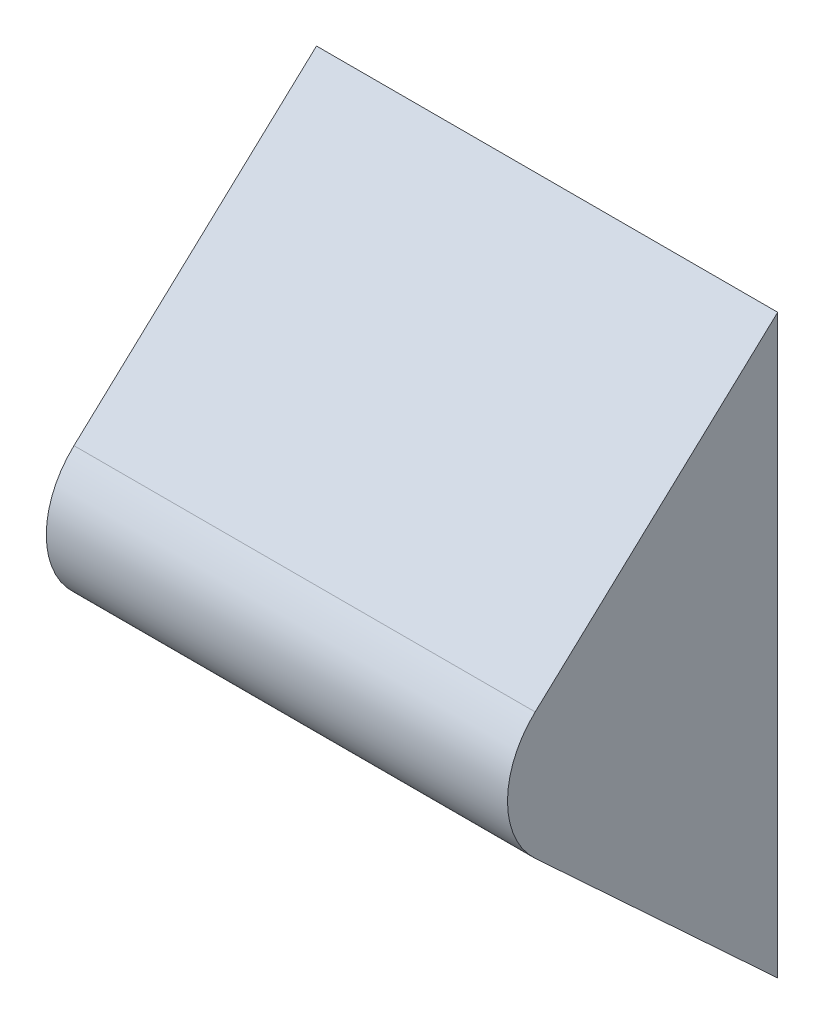
ISO-10303-21;
HEADER;
FILE_DESCRIPTION(('STEP AP214'),'2;1');
FILE_NAME('part.step','',(''),(''),'','','');
FILE_SCHEMA(('AUTOMOTIVE_DESIGN { 1 0 10303 214 1 1 1 1 }'));
ENDSEC;
DATA;
#1=APPLICATION_CONTEXT('core data for automotive mechanical design processes');
#2=APPLICATION_PROTOCOL_DEFINITION('international standard','automotive_design',2000,#1);
#3=PRODUCT_CONTEXT('',#1,'mechanical');
#4=PRODUCT('Part','Part','',(#3));
#5=PRODUCT_RELATED_PRODUCT_CATEGORY('part','',(#4));
#6=PRODUCT_DEFINITION_FORMATION('','',#4);
#7=PRODUCT_DEFINITION_CONTEXT('part definition',#1,'design');
#8=PRODUCT_DEFINITION('design','',#6,#7);
#9=PRODUCT_DEFINITION_SHAPE('','',#8);
#10=(LENGTH_UNIT() NAMED_UNIT(*) SI_UNIT(.MILLI.,.METRE.));
#11=(NAMED_UNIT(*) PLANE_ANGLE_UNIT() SI_UNIT($,.RADIAN.));
#12=(NAMED_UNIT(*) SI_UNIT($,.STERADIAN.) SOLID_ANGLE_UNIT());
#13=UNCERTAINTY_MEASURE_WITH_UNIT(LENGTH_MEASURE(1.E-05),#10,'distance_accuracy_value','');
#14=(GEOMETRIC_REPRESENTATION_CONTEXT(3) GLOBAL_UNCERTAINTY_ASSIGNED_CONTEXT((#13)) GLOBAL_UNIT_ASSIGNED_CONTEXT((#10,
#11,#12)) REPRESENTATION_CONTEXT('',''));
#15=CARTESIAN_POINT('',(0.,0.,0.));
#16=DIRECTION('',(0.,0.,1.));
#17=DIRECTION('',(1.,0.,0.));
#18=AXIS2_PLACEMENT_3D('',#15,#16,#17);
#19=CARTESIAN_POINT('',(40.,0.,0.));
#20=DIRECTION('',(-1.,0.,0.));
#21=DIRECTION('',(0.,0.,1.));
#22=AXIS2_PLACEMENT_3D('',#19,#20,#21);
#23=CYLINDRICAL_SURFACE('',#22,15.);
#24=CARTESIAN_POINT('',(-40.,0.,0.));
#25=DIRECTION('',(1.,0.,0.));
#26=DIRECTION('',(0.,0.,-1.));
#27=AXIS2_PLACEMENT_3D('',#24,#25,#26);
#28=CIRCLE('',#27,15.);
#29=CARTESIAN_POINT('',(-40.,11.,10.1980390271856));
#30=VERTEX_POINT('',#29);
#31=CARTESIAN_POINT('',(-40.,-11.,10.1980390271856));
#32=VERTEX_POINT('',#31);
#33=EDGE_CURVE('E98',#30,#32,#28,.T.);
#34=ORIENTED_EDGE('',*,*,#33,.T.);
#35=DIRECTION('',(-1.,0.,0.));
#36=VECTOR('',#35,1.);
#37=CARTESIAN_POINT('',(40.,-11.,10.1980390271856));
#38=LINE('',#37,#36);
#39=CARTESIAN_POINT('',(40.,-11.,10.1980390271856));
#40=VERTEX_POINT('',#39);
#41=EDGE_CURVE('E11',#40,#32,#38,.T.);
#42=ORIENTED_EDGE('',*,*,#41,.F.);
#43=CARTESIAN_POINT('',(40.,0.,0.));
#44=DIRECTION('',(1.,0.,0.));
#45=DIRECTION('',(0.,0.,-1.));
#46=AXIS2_PLACEMENT_3D('',#43,#44,#45);
#47=CIRCLE('',#46,15.);
#48=CARTESIAN_POINT('',(40.,11.,10.1980390271856));
#49=VERTEX_POINT('',#48);
#50=EDGE_CURVE('E86',#49,#40,#47,.T.);
#51=ORIENTED_EDGE('',*,*,#50,.F.);
#52=DIRECTION('',(-1.,0.,0.));
#53=VECTOR('',#52,1.);
#54=CARTESIAN_POINT('',(40.,11.,10.1980390271856));
#55=LINE('',#54,#53);
#56=EDGE_CURVE('E94',#49,#30,#55,.T.);
#57=ORIENTED_EDGE('',*,*,#56,.T.);
#58=EDGE_LOOP('',(#34,#42,#51,#57));
#59=FACE_BOUND('',#58,.T.);
#60=ADVANCED_FACE('F35',(#59),#23,.T.);
#61=CARTESIAN_POINT('',(40.,-11.,10.1980390271856));
#62=DIRECTION('',(0.,0.733333333333333,-0.679869268479038));
#63=DIRECTION('',(0.,0.679869268479038,0.733333333333333));
#64=AXIS2_PLACEMENT_3D('',#61,#62,#63);
#65=PLANE('',#64);
#66=DIRECTION('',(0.,-0.679869268479038,-0.733333333333333));
#67=VECTOR('',#66,1.);
#68=CARTESIAN_POINT('',(-40.,-11.,10.1980390271856));
#69=LINE('',#68,#67);
#70=CARTESIAN_POINT('',(-40.,-50.,-31.8688719599549));
#71=VERTEX_POINT('',#70);
#72=EDGE_CURVE('E90',#32,#71,#69,.T.);
#73=ORIENTED_EDGE('',*,*,#72,.T.);
#74=DIRECTION('',(-1.,0.,0.));
#75=VECTOR('',#74,1.);
#76=CARTESIAN_POINT('',(40.,-50.,-31.8688719599549));
#77=LINE('',#76,#75);
#78=CARTESIAN_POINT('',(40.,-50.,-31.8688719599549));
#79=VERTEX_POINT('',#78);
#80=EDGE_CURVE('E43',#79,#71,#77,.T.);
#81=ORIENTED_EDGE('',*,*,#80,.F.);
#82=DIRECTION('',(0.,-0.679869268479038,-0.733333333333333));
#83=VECTOR('',#82,1.);
#84=CARTESIAN_POINT('',(40.,-11.,10.1980390271856));
#85=LINE('',#84,#83);
#86=EDGE_CURVE('E81',#40,#79,#85,.T.);
#87=ORIENTED_EDGE('',*,*,#86,.F.);
#88=ORIENTED_EDGE('',*,*,#41,.T.);
#89=EDGE_LOOP('',(#73,#81,#87,#88));
#90=FACE_BOUND('',#89,.T.);
#91=ADVANCED_FACE('F89',(#90),#65,.F.);
#92=CARTESIAN_POINT('',(40.,50.,-31.8688719599549));
#93=DIRECTION('',(0.,0.,1.));
#94=DIRECTION('',(0.,-1.,0.));
#95=AXIS2_PLACEMENT_3D('',#92,#93,#94);
#96=PLANE('',#95);
#97=DIRECTION('',(0.,1.,0.));
#98=VECTOR('',#97,1.);
#99=CARTESIAN_POINT('',(-40.,50.,-31.8688719599549));
#100=LINE('',#99,#98);
#101=CARTESIAN_POINT('',(-40.,50.,-31.8688719599549));
#102=VERTEX_POINT('',#101);
#103=EDGE_CURVE('E68',#71,#102,#100,.T.);
#104=ORIENTED_EDGE('',*,*,#103,.T.);
#105=DIRECTION('',(-1.,0.,0.));
#106=VECTOR('',#105,1.);
#107=CARTESIAN_POINT('',(40.,50.,-31.8688719599549));
#108=LINE('',#107,#106);
#109=CARTESIAN_POINT('',(40.,50.,-31.8688719599549));
#110=VERTEX_POINT('',#109);
#111=EDGE_CURVE('E91',#110,#102,#108,.T.);
#112=ORIENTED_EDGE('',*,*,#111,.F.);
#113=DIRECTION('',(0.,1.,0.));
#114=VECTOR('',#113,1.);
#115=CARTESIAN_POINT('',(40.,50.,-31.8688719599549));
#116=LINE('',#115,#114);
#117=EDGE_CURVE('E84',#79,#110,#116,.T.);
#118=ORIENTED_EDGE('',*,*,#117,.F.);
#119=ORIENTED_EDGE('',*,*,#80,.T.);
#120=EDGE_LOOP('',(#104,#112,#118,#119));
#121=FACE_BOUND('',#120,.T.);
#122=ADVANCED_FACE('F92',(#121),#96,.F.);
#123=CARTESIAN_POINT('',(40.,11.,10.1980390271856));
#124=DIRECTION('',(0.,-0.733333333333333,-0.679869268479038));
#125=DIRECTION('',(0.,0.679869268479038,-0.733333333333333));
#126=AXIS2_PLACEMENT_3D('',#123,#124,#125);
#127=PLANE('',#126);
#128=DIRECTION('',(0.,-0.679869268479038,0.733333333333333));
#129=VECTOR('',#128,1.);
#130=CARTESIAN_POINT('',(-40.,11.,10.1980390271856));
#131=LINE('',#130,#129);
#132=EDGE_CURVE('E74',#102,#30,#131,.T.);
#133=ORIENTED_EDGE('',*,*,#132,.T.);
#134=ORIENTED_EDGE('',*,*,#56,.F.);
#135=DIRECTION('',(0.,-0.679869268479038,0.733333333333333));
#136=VECTOR('',#135,1.);
#137=CARTESIAN_POINT('',(40.,11.,10.1980390271856));
#138=LINE('',#137,#136);
#139=EDGE_CURVE('E51',#110,#49,#138,.T.);
#140=ORIENTED_EDGE('',*,*,#139,.F.);
#141=ORIENTED_EDGE('',*,*,#111,.T.);
#142=EDGE_LOOP('',(#133,#134,#140,#141));
#143=FACE_BOUND('',#142,.T.);
#144=ADVANCED_FACE('F105',(#143),#127,.F.);
#145=CARTESIAN_POINT('',(40.,0.,0.));
#146=DIRECTION('',(1.,0.,0.));
#147=DIRECTION('',(0.,0.,-1.));
#148=AXIS2_PLACEMENT_3D('',#145,#146,#147);
#149=PLANE('',#148);
#150=ORIENTED_EDGE('',*,*,#50,.T.);
#151=ORIENTED_EDGE('',*,*,#86,.T.);
#152=ORIENTED_EDGE('',*,*,#117,.T.);
#153=ORIENTED_EDGE('',*,*,#139,.T.);
#154=EDGE_LOOP('',(#150,#151,#152,#153));
#155=FACE_BOUND('',#154,.T.);
#156=ADVANCED_FACE('F82',(#155),#149,.T.);
#157=CARTESIAN_POINT('',(-40.,0.,0.));
#158=DIRECTION('',(1.,0.,0.));
#159=DIRECTION('',(0.,0.,-1.));
#160=AXIS2_PLACEMENT_3D('',#157,#158,#159);
#161=PLANE('',#160);
#162=ORIENTED_EDGE('',*,*,#33,.F.);
#163=ORIENTED_EDGE('',*,*,#132,.F.);
#164=ORIENTED_EDGE('',*,*,#103,.F.);
#165=ORIENTED_EDGE('',*,*,#72,.F.);
#166=EDGE_LOOP('',(#162,#163,#164,#165));
#167=FACE_BOUND('',#166,.T.);
#168=ADVANCED_FACE('F108',(#167),#161,.F.);
#169=CLOSED_SHELL('',(#60,#91,#122,#144,#156,#168));
#170=MANIFOLD_SOLID_BREP('B2',#169);
#171=ADVANCED_BREP_SHAPE_REPRESENTATION('',(#18,#170),#14);
#172=SHAPE_DEFINITION_REPRESENTATION(#9,#171);
ENDSEC;
END-ISO-10303-21;
